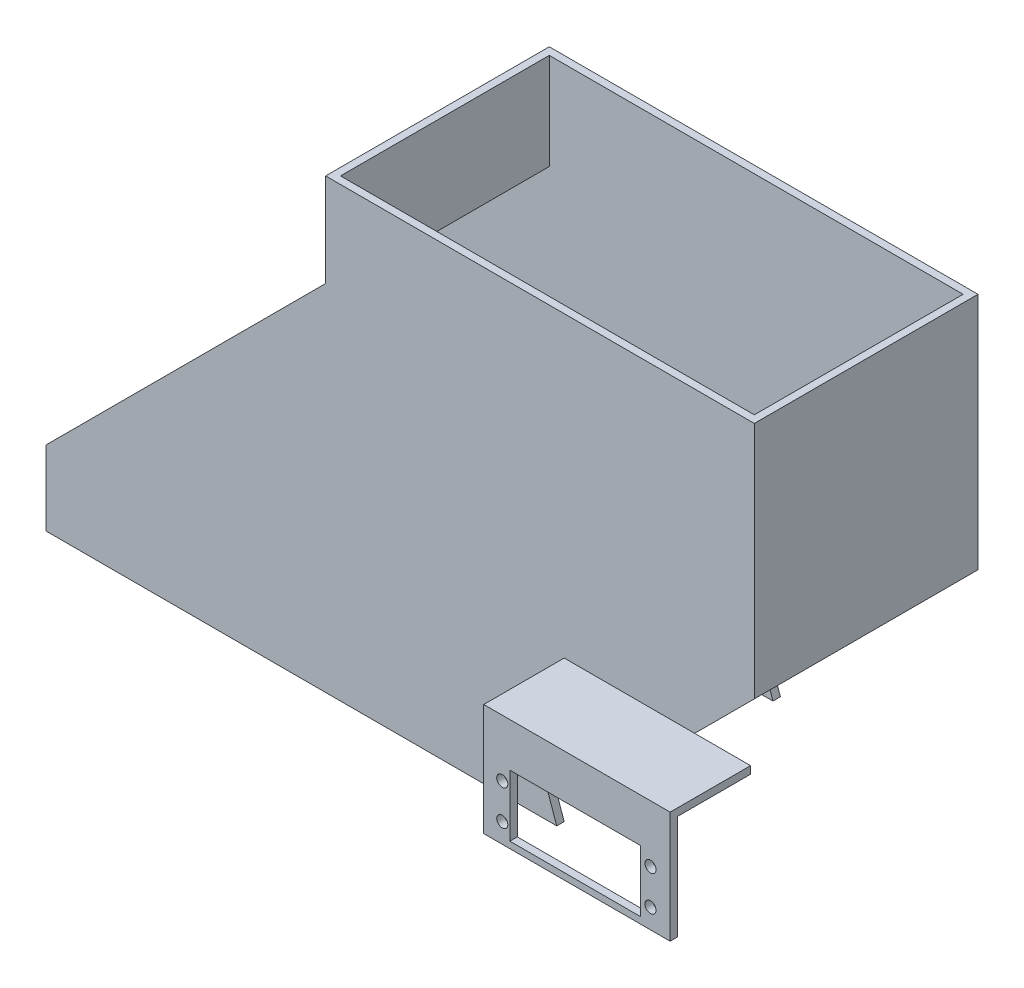
ISO-10303-21;
HEADER;
FILE_DESCRIPTION(('STEP AP214'),'2;1');
FILE_NAME('part.step','',(''),(''),'','','');
FILE_SCHEMA(('AUTOMOTIVE_DESIGN { 1 0 10303 214 1 1 1 1 }'));
ENDSEC;
DATA;
#1=APPLICATION_CONTEXT('core data for automotive mechanical design processes');
#2=APPLICATION_PROTOCOL_DEFINITION('international standard','automotive_design',2000,#1);
#3=PRODUCT_CONTEXT('',#1,'mechanical');
#4=PRODUCT('Part','Part','',(#3));
#5=PRODUCT_RELATED_PRODUCT_CATEGORY('part','',(#4));
#6=PRODUCT_DEFINITION_FORMATION('','',#4);
#7=PRODUCT_DEFINITION_CONTEXT('part definition',#1,'design');
#8=PRODUCT_DEFINITION('design','',#6,#7);
#9=PRODUCT_DEFINITION_SHAPE('','',#8);
#10=(LENGTH_UNIT() NAMED_UNIT(*) SI_UNIT(.MILLI.,.METRE.));
#11=(NAMED_UNIT(*) PLANE_ANGLE_UNIT() SI_UNIT($,.RADIAN.));
#12=(NAMED_UNIT(*) SI_UNIT($,.STERADIAN.) SOLID_ANGLE_UNIT());
#13=UNCERTAINTY_MEASURE_WITH_UNIT(LENGTH_MEASURE(1.E-05),#10,'distance_accuracy_value','');
#14=(GEOMETRIC_REPRESENTATION_CONTEXT(3) GLOBAL_UNCERTAINTY_ASSIGNED_CONTEXT((#13)) GLOBAL_UNIT_ASSIGNED_CONTEXT((#10,
#11,#12)) REPRESENTATION_CONTEXT('',''));
#15=CARTESIAN_POINT('',(0.,0.,0.));
#16=DIRECTION('',(0.,0.,1.));
#17=DIRECTION('',(1.,0.,0.));
#18=AXIS2_PLACEMENT_3D('',#15,#16,#17);
#19=CARTESIAN_POINT('',(54.0000000000001,0.,30.));
#20=DIRECTION('',(0.,1.,0.));
#21=DIRECTION('',(0.,0.,1.));
#22=AXIS2_PLACEMENT_3D('',#19,#20,#21);
#23=PLANE('',#22);
#24=DIRECTION('',(1.,0.,0.));
#25=VECTOR('',#24,1.);
#26=CARTESIAN_POINT('',(54.0000000000001,0.,-28.));
#27=LINE('',#26,#25);
#28=CARTESIAN_POINT('',(54.0000000000001,0.,-28.));
#29=VERTEX_POINT('',#28);
#30=CARTESIAN_POINT('',(74.1715728752539,0.,-28.));
#31=VERTEX_POINT('',#30);
#32=EDGE_CURVE('E317',#29,#31,#27,.T.);
#33=ORIENTED_EDGE('',*,*,#32,.F.);
#34=DIRECTION('',(0.,0.,-1.));
#35=VECTOR('',#34,1.);
#36=CARTESIAN_POINT('',(54.0000000000001,0.,30.));
#37=LINE('',#36,#35);
#38=CARTESIAN_POINT('',(54.0000000000001,0.,-30.));
#39=VERTEX_POINT('',#38);
#40=EDGE_CURVE('E409',#29,#39,#37,.T.);
#41=ORIENTED_EDGE('',*,*,#40,.T.);
#42=DIRECTION('',(1.,0.,0.));
#43=VECTOR('',#42,1.);
#44=CARTESIAN_POINT('',(54.0000000000001,0.,-30.));
#45=LINE('',#44,#43);
#46=CARTESIAN_POINT('',(77.0000000000001,0.,-30.));
#47=VERTEX_POINT('',#46);
#48=EDGE_CURVE('E352',#39,#47,#45,.T.);
#49=ORIENTED_EDGE('',*,*,#48,.T.);
#50=DIRECTION('',(0.,0.,-1.));
#51=VECTOR('',#50,1.);
#52=CARTESIAN_POINT('',(77.0000000000001,0.,30.));
#53=LINE('',#52,#51);
#54=CARTESIAN_POINT('',(77.0000000000001,0.,30.));
#55=VERTEX_POINT('',#54);
#56=EDGE_CURVE('E36',#55,#47,#53,.T.);
#57=ORIENTED_EDGE('',*,*,#56,.F.);
#58=DIRECTION('',(1.,0.,0.));
#59=VECTOR('',#58,1.);
#60=CARTESIAN_POINT('',(54.0000000000001,0.,30.));
#61=LINE('',#60,#59);
#62=CARTESIAN_POINT('',(54.0000000000001,0.,30.));
#63=VERTEX_POINT('',#62);
#64=EDGE_CURVE('E384',#63,#55,#61,.T.);
#65=ORIENTED_EDGE('',*,*,#64,.F.);
#66=CARTESIAN_POINT('',(54.0000000000001,0.,28.));
#67=VERTEX_POINT('',#66);
#68=EDGE_CURVE('E433',#63,#67,#37,.T.);
#69=ORIENTED_EDGE('',*,*,#68,.T.);
#70=DIRECTION('',(1.,0.,0.));
#71=VECTOR('',#70,1.);
#72=CARTESIAN_POINT('',(54.0000000000001,0.,28.));
#73=LINE('',#72,#71);
#74=CARTESIAN_POINT('',(74.1715728752539,0.,28.));
#75=VERTEX_POINT('',#74);
#76=EDGE_CURVE('E329',#67,#75,#73,.T.);
#77=ORIENTED_EDGE('',*,*,#76,.T.);
#78=DIRECTION('',(0.,0.,-1.));
#79=VECTOR('',#78,1.);
#80=CARTESIAN_POINT('',(74.1715728752539,0.,30.));
#81=LINE('',#80,#79);
#82=EDGE_CURVE('E324',#75,#31,#81,.T.);
#83=ORIENTED_EDGE('',*,*,#82,.T.);
#84=EDGE_LOOP('',(#33,#41,#49,#57,#65,#69,#77,#83));
#85=FACE_BOUND('',#84,.T.);
#86=ADVANCED_FACE('F33',(#85),#23,.F.);
#87=CARTESIAN_POINT('',(113.,100.,30.));
#88=DIRECTION('',(0.,-1.,0.));
#89=DIRECTION('',(1.,0.,0.));
#90=AXIS2_PLACEMENT_3D('',#87,#88,#89);
#91=PLANE('',#90);
#92=DIRECTION('',(-1.,0.,0.));
#93=VECTOR('',#92,1.);
#94=CARTESIAN_POINT('',(113.,100.,-30.));
#95=LINE('',#94,#93);
#96=CARTESIAN_POINT('',(113.,100.,-30.));
#97=VERTEX_POINT('',#96);
#98=CARTESIAN_POINT('',(-2.00000000000025,100.,-30.));
#99=VERTEX_POINT('',#98);
#100=EDGE_CURVE('E416',#97,#99,#95,.T.);
#101=ORIENTED_EDGE('',*,*,#100,.T.);
#102=DIRECTION('',(0.,0.,-1.));
#103=VECTOR('',#102,1.);
#104=CARTESIAN_POINT('',(-2.00000000000025,100.,30.));
#105=LINE('',#104,#103);
#106=CARTESIAN_POINT('',(-2.00000000000025,100.,30.));
#107=VERTEX_POINT('',#106);
#108=EDGE_CURVE('E454',#107,#99,#105,.T.);
#109=ORIENTED_EDGE('',*,*,#108,.F.);
#110=DIRECTION('',(-1.,0.,0.));
#111=VECTOR('',#110,1.);
#112=CARTESIAN_POINT('',(113.,100.,30.));
#113=LINE('',#112,#111);
#114=CARTESIAN_POINT('',(113.,100.,30.));
#115=VERTEX_POINT('',#114);
#116=EDGE_CURVE('E395',#115,#107,#113,.T.);
#117=ORIENTED_EDGE('',*,*,#116,.F.);
#118=DIRECTION('',(0.,0.,-1.));
#119=VECTOR('',#118,1.);
#120=CARTESIAN_POINT('',(113.,100.,30.));
#121=LINE('',#120,#119);
#122=EDGE_CURVE('E457',#115,#97,#121,.T.);
#123=ORIENTED_EDGE('',*,*,#122,.T.);
#124=EDGE_LOOP('',(#101,#109,#117,#123));
#125=FACE_BOUND('',#124,.T.);
#126=DIRECTION('',(-1.,0.,0.));
#127=VECTOR('',#126,1.);
#128=CARTESIAN_POINT('',(113.,100.,-28.));
#129=LINE('',#128,#127);
#130=CARTESIAN_POINT('',(111.,100.,-28.));
#131=VERTEX_POINT('',#130);
#132=CARTESIAN_POINT('',(-2.51534904016637E-13,100.,-28.));
#133=VERTEX_POINT('',#132);
#134=EDGE_CURVE('E331',#131,#133,#129,.T.);
#135=ORIENTED_EDGE('',*,*,#134,.F.);
#136=DIRECTION('',(0.,0.,-1.));
#137=VECTOR('',#136,1.);
#138=CARTESIAN_POINT('',(111.,100.,30.));
#139=LINE('',#138,#137);
#140=CARTESIAN_POINT('',(111.,100.,28.));
#141=VERTEX_POINT('',#140);
#142=EDGE_CURVE('E325',#141,#131,#139,.T.);
#143=ORIENTED_EDGE('',*,*,#142,.F.);
#144=DIRECTION('',(-1.,0.,0.));
#145=VECTOR('',#144,1.);
#146=CARTESIAN_POINT('',(113.,100.,28.));
#147=LINE('',#146,#145);
#148=CARTESIAN_POINT('',(-2.51534904016637E-13,100.,28.));
#149=VERTEX_POINT('',#148);
#150=EDGE_CURVE('E334',#141,#149,#147,.T.);
#151=ORIENTED_EDGE('',*,*,#150,.T.);
#152=DIRECTION('',(0.,0.,-1.));
#153=VECTOR('',#152,1.);
#154=CARTESIAN_POINT('',(-2.51534904016637E-13,100.,30.));
#155=LINE('',#154,#153);
#156=EDGE_CURVE('E346',#149,#133,#155,.T.);
#157=ORIENTED_EDGE('',*,*,#156,.T.);
#158=EDGE_LOOP('',(#135,#143,#151,#157));
#159=FACE_BOUND('',#158,.T.);
#160=ADVANCED_FACE('F490',(#125,#159),#91,.F.);
#161=CARTESIAN_POINT('',(-76.9999999999999,0.,30.));
#162=DIRECTION('',(1.,0.,0.));
#163=DIRECTION('',(0.,1.,0.));
#164=AXIS2_PLACEMENT_3D('',#161,#162,#163);
#165=PLANE('',#164);
#166=DIRECTION('',(0.,-1.,0.));
#167=VECTOR('',#166,1.);
#168=CARTESIAN_POINT('',(-76.9999999999999,0.,-28.));
#169=LINE('',#168,#167);
#170=CARTESIAN_POINT('',(-76.9999999999999,-2.82842712474619,-28.));
#171=VERTEX_POINT('',#170);
#172=CARTESIAN_POINT('',(-76.9999999999999,-20.,-28.));
#173=VERTEX_POINT('',#172);
#174=EDGE_CURVE('E349',#171,#173,#169,.T.);
#175=ORIENTED_EDGE('',*,*,#174,.F.);
#176=DIRECTION('',(0.,0.,-1.));
#177=VECTOR('',#176,1.);
#178=CARTESIAN_POINT('',(-76.9999999999999,-2.82842712474619,30.));
#179=LINE('',#178,#177);
#180=CARTESIAN_POINT('',(-76.9999999999999,-2.82842712474619,28.));
#181=VERTEX_POINT('',#180);
#182=EDGE_CURVE('E347',#181,#171,#179,.T.);
#183=ORIENTED_EDGE('',*,*,#182,.F.);
#184=DIRECTION('',(0.,-1.,0.));
#185=VECTOR('',#184,1.);
#186=CARTESIAN_POINT('',(-76.9999999999999,0.,28.));
#187=LINE('',#186,#185);
#188=CARTESIAN_POINT('',(-76.9999999999999,-20.,28.));
#189=VERTEX_POINT('',#188);
#190=EDGE_CURVE('E339',#181,#189,#187,.T.);
#191=ORIENTED_EDGE('',*,*,#190,.T.);
#192=DIRECTION('',(0.,0.,-1.));
#193=VECTOR('',#192,1.);
#194=CARTESIAN_POINT('',(-76.9999999999999,-20.,30.));
#195=LINE('',#194,#193);
#196=CARTESIAN_POINT('',(-76.9999999999999,-20.,30.));
#197=VERTEX_POINT('',#196);
#198=EDGE_CURVE('E445',#197,#189,#195,.T.);
#199=ORIENTED_EDGE('',*,*,#198,.F.);
#200=DIRECTION('',(0.,-1.,0.));
#201=VECTOR('',#200,1.);
#202=CARTESIAN_POINT('',(-76.9999999999999,0.,30.));
#203=LINE('',#202,#201);
#204=CARTESIAN_POINT('',(-76.9999999999999,0.,30.));
#205=VERTEX_POINT('',#204);
#206=EDGE_CURVE('E401',#205,#197,#203,.T.);
#207=ORIENTED_EDGE('',*,*,#206,.F.);
#208=DIRECTION('',(0.,0.,-1.));
#209=VECTOR('',#208,1.);
#210=CARTESIAN_POINT('',(-76.9999999999999,0.,30.));
#211=LINE('',#210,#209);
#212=CARTESIAN_POINT('',(-76.9999999999999,0.,-30.));
#213=VERTEX_POINT('',#212);
#214=EDGE_CURVE('E448',#205,#213,#211,.T.);
#215=ORIENTED_EDGE('',*,*,#214,.T.);
#216=DIRECTION('',(0.,-1.,0.));
#217=VECTOR('',#216,1.);
#218=CARTESIAN_POINT('',(-76.9999999999999,0.,-30.));
#219=LINE('',#218,#217);
#220=CARTESIAN_POINT('',(-76.9999999999999,-20.,-30.));
#221=VERTEX_POINT('',#220);
#222=EDGE_CURVE('E422',#213,#221,#219,.T.);
#223=ORIENTED_EDGE('',*,*,#222,.T.);
#224=EDGE_CURVE('E444',#173,#221,#195,.T.);
#225=ORIENTED_EDGE('',*,*,#224,.F.);
#226=EDGE_LOOP('',(#175,#183,#191,#199,#207,#215,#223,#225));
#227=FACE_BOUND('',#226,.T.);
#228=ADVANCED_FACE('F507',(#227),#165,.F.);
#229=CARTESIAN_POINT('',(-76.9999999999999,-20.,30.));
#230=DIRECTION('',(0.,1.,0.));
#231=DIRECTION('',(0.,0.,1.));
#232=AXIS2_PLACEMENT_3D('',#229,#230,#231);
#233=PLANE('',#232);
#234=DIRECTION('',(1.,0.,0.));
#235=VECTOR('',#234,1.);
#236=CARTESIAN_POINT('',(-76.9999999999999,-20.,-28.));
#237=LINE('',#236,#235);
#238=CARTESIAN_POINT('',(60.0000000000001,-20.,-28.));
#239=VERTEX_POINT('',#238);
#240=EDGE_CURVE('E370',#173,#239,#237,.T.);
#241=ORIENTED_EDGE('',*,*,#240,.F.);
#242=ORIENTED_EDGE('',*,*,#224,.T.);
#243=DIRECTION('',(1.,0.,0.));
#244=VECTOR('',#243,1.);
#245=CARTESIAN_POINT('',(-76.9999999999999,-20.,-30.));
#246=LINE('',#245,#244);
#247=CARTESIAN_POINT('',(60.0000000000001,-20.,-30.));
#248=VERTEX_POINT('',#247);
#249=EDGE_CURVE('E425',#221,#248,#246,.T.);
#250=ORIENTED_EDGE('',*,*,#249,.T.);
#251=DIRECTION('',(0.,0.,-1.));
#252=VECTOR('',#251,1.);
#253=CARTESIAN_POINT('',(60.0000000000001,-20.,30.));
#254=LINE('',#253,#252);
#255=EDGE_CURVE('E440',#239,#248,#254,.T.);
#256=ORIENTED_EDGE('',*,*,#255,.F.);
#257=EDGE_LOOP('',(#241,#242,#250,#256));
#258=FACE_BOUND('',#257,.T.);
#259=ADVANCED_FACE('F534',(#258),#233,.F.);
#260=CARTESIAN_POINT('',(54.0000000000001,-3.,30.));
#261=DIRECTION('',(-0.942990333582889,-0.332820117735138,0.));
#262=DIRECTION('',(0.332820117735138,-0.942990333582889,0.));
#263=AXIS2_PLACEMENT_3D('',#260,#261,#262);
#264=PLANE('',#263);
#265=DIRECTION('',(-0.332820117735138,0.942990333582889,0.));
#266=VECTOR('',#265,1.);
#267=CARTESIAN_POINT('',(54.0000000000001,-3.,-28.));
#268=LINE('',#267,#266);
#269=CARTESIAN_POINT('',(54.0000000000001,-3.,-28.));
#270=VERTEX_POINT('',#269);
#271=EDGE_CURVE('E372',#239,#270,#268,.T.);
#272=ORIENTED_EDGE('',*,*,#271,.F.);
#273=ORIENTED_EDGE('',*,*,#255,.T.);
#274=DIRECTION('',(-0.332820117735138,0.942990333582889,0.));
#275=VECTOR('',#274,1.);
#276=CARTESIAN_POINT('',(54.0000000000001,-3.,-30.));
#277=LINE('',#276,#275);
#278=CARTESIAN_POINT('',(54.0000000000001,-3.,-30.));
#279=VERTEX_POINT('',#278);
#280=EDGE_CURVE('E428',#248,#279,#277,.T.);
#281=ORIENTED_EDGE('',*,*,#280,.T.);
#282=DIRECTION('',(0.,0.,-1.));
#283=VECTOR('',#282,1.);
#284=CARTESIAN_POINT('',(54.0000000000001,-3.,30.));
#285=LINE('',#284,#283);
#286=EDGE_CURVE('E436',#270,#279,#285,.T.);
#287=ORIENTED_EDGE('',*,*,#286,.F.);
#288=EDGE_LOOP('',(#272,#273,#281,#287));
#289=FACE_BOUND('',#288,.T.);
#290=ADVANCED_FACE('F542',(#289),#264,.F.);
#291=CARTESIAN_POINT('',(54.0000000000001,-3.,30.));
#292=DIRECTION('',(-1.,0.,0.));
#293=DIRECTION('',(0.,-1.,0.));
#294=AXIS2_PLACEMENT_3D('',#291,#292,#293);
#295=PLANE('',#294);
#296=DIRECTION('',(0.,1.,0.));
#297=VECTOR('',#296,1.);
#298=CARTESIAN_POINT('',(54.0000000000001,-3.,-28.));
#299=LINE('',#298,#297);
#300=EDGE_CURVE('E355',#270,#29,#299,.T.);
#301=ORIENTED_EDGE('',*,*,#300,.F.);
#302=ORIENTED_EDGE('',*,*,#286,.T.);
#303=DIRECTION('',(0.,1.,0.));
#304=VECTOR('',#303,1.);
#305=CARTESIAN_POINT('',(54.0000000000001,-3.,-30.));
#306=LINE('',#305,#304);
#307=EDGE_CURVE('E388',#279,#39,#306,.T.);
#308=ORIENTED_EDGE('',*,*,#307,.T.);
#309=ORIENTED_EDGE('',*,*,#40,.F.);
#310=EDGE_LOOP('',(#301,#302,#308,#309));
#311=FACE_BOUND('',#310,.T.);
#312=ADVANCED_FACE('F544',(#311),#295,.F.);
#313=CARTESIAN_POINT('',(77.0000000000001,0.,30.));
#314=DIRECTION('',(-0.707106781186549,0.707106781186546,0.));
#315=DIRECTION('',(-0.707106781186546,-0.707106781186549,0.));
#316=AXIS2_PLACEMENT_3D('',#313,#314,#315);
#317=PLANE('',#316);
#318=DIRECTION('',(0.707106781186546,0.707106781186548,0.));
#319=VECTOR('',#318,1.);
#320=CARTESIAN_POINT('',(77.0000000000001,0.,-30.));
#321=LINE('',#320,#319);
#322=CARTESIAN_POINT('',(113.,35.9999999999998,-30.));
#323=VERTEX_POINT('',#322);
#324=EDGE_CURVE('E412',#47,#323,#321,.T.);
#325=ORIENTED_EDGE('',*,*,#324,.T.);
#326=DIRECTION('',(0.,0.,-1.));
#327=VECTOR('',#326,1.);
#328=CARTESIAN_POINT('',(113.,35.9999999999998,30.));
#329=LINE('',#328,#327);
#330=CARTESIAN_POINT('',(113.,35.9999999999998,30.));
#331=VERTEX_POINT('',#330);
#332=EDGE_CURVE('E459',#331,#323,#329,.T.);
#333=ORIENTED_EDGE('',*,*,#332,.F.);
#334=DIRECTION('',(0.707106781186546,0.707106781186548,0.));
#335=VECTOR('',#334,1.);
#336=CARTESIAN_POINT('',(77.0000000000001,0.,30.));
#337=LINE('',#336,#335);
#338=CARTESIAN_POINT('',(97.,20.,30.));
#339=VERTEX_POINT('',#338);
#340=EDGE_CURVE('E387',#339,#331,#337,.T.);
#341=ORIENTED_EDGE('',*,*,#340,.F.);
#342=CARTESIAN_POINT('',(95.,18.,30.));
#343=VERTEX_POINT('',#342);
#344=EDGE_CURVE('E393',#343,#339,#337,.T.);
#345=ORIENTED_EDGE('',*,*,#344,.F.);
#346=EDGE_CURVE('E389',#55,#343,#337,.T.);
#347=ORIENTED_EDGE('',*,*,#346,.F.);
#348=ORIENTED_EDGE('',*,*,#56,.T.);
#349=EDGE_LOOP('',(#325,#333,#341,#345,#347,#348));
#350=FACE_BOUND('',#349,.T.);
#351=ADVANCED_FACE('F483',(#350),#317,.F.);
#352=CARTESIAN_POINT('',(113.,35.9999999999998,30.));
#353=DIRECTION('',(-1.,0.,0.));
#354=DIRECTION('',(0.,-1.,0.));
#355=AXIS2_PLACEMENT_3D('',#352,#353,#354);
#356=PLANE('',#355);
#357=DIRECTION('',(0.,1.,0.));
#358=VECTOR('',#357,1.);
#359=CARTESIAN_POINT('',(113.,35.9999999999998,-30.));
#360=LINE('',#359,#358);
#361=EDGE_CURVE('E414',#323,#97,#360,.T.);
#362=ORIENTED_EDGE('',*,*,#361,.T.);
#363=ORIENTED_EDGE('',*,*,#122,.F.);
#364=DIRECTION('',(0.,1.,0.));
#365=VECTOR('',#364,1.);
#366=CARTESIAN_POINT('',(113.,35.9999999999998,30.));
#367=LINE('',#366,#365);
#368=EDGE_CURVE('E392',#331,#115,#367,.T.);
#369=ORIENTED_EDGE('',*,*,#368,.F.);
#370=ORIENTED_EDGE('',*,*,#332,.T.);
#371=EDGE_LOOP('',(#362,#363,#369,#370));
#372=FACE_BOUND('',#371,.T.);
#373=ADVANCED_FACE('F485',(#372),#356,.F.);
#374=CARTESIAN_POINT('',(-2.00000000000025,100.,30.));
#375=DIRECTION('',(1.,0.,0.));
#376=DIRECTION('',(0.,1.,0.));
#377=AXIS2_PLACEMENT_3D('',#374,#375,#376);
#378=PLANE('',#377);
#379=DIRECTION('',(0.,-1.,0.));
#380=VECTOR('',#379,1.);
#381=CARTESIAN_POINT('',(-2.00000000000025,100.,-30.));
#382=LINE('',#381,#380);
#383=CARTESIAN_POINT('',(-2.00000000000022,74.9999999999999,-30.));
#384=VERTEX_POINT('',#383);
#385=EDGE_CURVE('E418',#99,#384,#382,.T.);
#386=ORIENTED_EDGE('',*,*,#385,.T.);
#387=DIRECTION('',(0.,0.,-1.));
#388=VECTOR('',#387,1.);
#389=CARTESIAN_POINT('',(-2.00000000000022,74.9999999999999,30.));
#390=LINE('',#389,#388);
#391=CARTESIAN_POINT('',(-2.00000000000022,74.9999999999999,30.));
#392=VERTEX_POINT('',#391);
#393=EDGE_CURVE('E451',#392,#384,#390,.T.);
#394=ORIENTED_EDGE('',*,*,#393,.F.);
#395=DIRECTION('',(0.,-1.,0.));
#396=VECTOR('',#395,1.);
#397=CARTESIAN_POINT('',(-2.00000000000025,100.,30.));
#398=LINE('',#397,#396);
#399=EDGE_CURVE('E397',#107,#392,#398,.T.);
#400=ORIENTED_EDGE('',*,*,#399,.F.);
#401=ORIENTED_EDGE('',*,*,#108,.T.);
#402=EDGE_LOOP('',(#386,#394,#400,#401));
#403=FACE_BOUND('',#402,.T.);
#404=ADVANCED_FACE('F497',(#403),#378,.F.);
#405=CARTESIAN_POINT('',(-2.00000000000022,74.9999999999999,30.));
#406=DIRECTION('',(0.707106781186549,-0.707106781186546,0.));
#407=DIRECTION('',(0.707106781186546,0.707106781186549,0.));
#408=AXIS2_PLACEMENT_3D('',#405,#406,#407);
#409=PLANE('',#408);
#410=DIRECTION('',(-0.707106781186546,-0.707106781186549,0.));
#411=VECTOR('',#410,1.);
#412=CARTESIAN_POINT('',(-2.00000000000022,74.9999999999999,-30.));
#413=LINE('',#412,#411);
#414=EDGE_CURVE('E420',#384,#213,#413,.T.);
#415=ORIENTED_EDGE('',*,*,#414,.T.);
#416=ORIENTED_EDGE('',*,*,#214,.F.);
#417=DIRECTION('',(-0.707106781186546,-0.707106781186549,0.));
#418=VECTOR('',#417,1.);
#419=CARTESIAN_POINT('',(-2.00000000000022,74.9999999999999,30.));
#420=LINE('',#419,#418);
#421=EDGE_CURVE('E399',#392,#205,#420,.T.);
#422=ORIENTED_EDGE('',*,*,#421,.F.);
#423=ORIENTED_EDGE('',*,*,#393,.T.);
#424=EDGE_LOOP('',(#415,#416,#422,#423));
#425=FACE_BOUND('',#424,.T.);
#426=ADVANCED_FACE('F501',(#425),#409,.F.);
#427=ORIENTED_EDGE('',*,*,#198,.T.);
#428=DIRECTION('',(1.,0.,0.));
#429=VECTOR('',#428,1.);
#430=CARTESIAN_POINT('',(-76.9999999999999,-20.,28.));
#431=LINE('',#430,#429);
#432=CARTESIAN_POINT('',(60.0000000000001,-20.,28.));
#433=VERTEX_POINT('',#432);
#434=EDGE_CURVE('E362',#189,#433,#431,.T.);
#435=ORIENTED_EDGE('',*,*,#434,.T.);
#436=CARTESIAN_POINT('',(60.0000000000001,-20.,30.));
#437=VERTEX_POINT('',#436);
#438=EDGE_CURVE('E441',#437,#433,#254,.T.);
#439=ORIENTED_EDGE('',*,*,#438,.F.);
#440=DIRECTION('',(1.,0.,0.));
#441=VECTOR('',#440,1.);
#442=CARTESIAN_POINT('',(-76.9999999999999,-20.,30.));
#443=LINE('',#442,#441);
#444=EDGE_CURVE('E403',#197,#437,#443,.T.);
#445=ORIENTED_EDGE('',*,*,#444,.F.);
#446=EDGE_LOOP('',(#427,#435,#439,#445));
#447=FACE_BOUND('',#446,.T.);
#448=ADVANCED_FACE('F513',(#447),#233,.F.);
#449=ORIENTED_EDGE('',*,*,#438,.T.);
#450=DIRECTION('',(-0.332820117735138,0.942990333582889,0.));
#451=VECTOR('',#450,1.);
#452=CARTESIAN_POINT('',(54.0000000000001,-3.,28.));
#453=LINE('',#452,#451);
#454=CARTESIAN_POINT('',(54.0000000000001,-3.,28.));
#455=VERTEX_POINT('',#454);
#456=EDGE_CURVE('E359',#433,#455,#453,.T.);
#457=ORIENTED_EDGE('',*,*,#456,.T.);
#458=CARTESIAN_POINT('',(54.0000000000001,-3.,30.));
#459=VERTEX_POINT('',#458);
#460=EDGE_CURVE('E437',#459,#455,#285,.T.);
#461=ORIENTED_EDGE('',*,*,#460,.F.);
#462=DIRECTION('',(-0.332820117735138,0.942990333582889,0.));
#463=VECTOR('',#462,1.);
#464=CARTESIAN_POINT('',(54.0000000000001,-3.,30.));
#465=LINE('',#464,#463);
#466=EDGE_CURVE('E405',#437,#459,#465,.T.);
#467=ORIENTED_EDGE('',*,*,#466,.F.);
#468=EDGE_LOOP('',(#449,#457,#461,#467));
#469=FACE_BOUND('',#468,.T.);
#470=ADVANCED_FACE('F515',(#469),#264,.F.);
#471=ORIENTED_EDGE('',*,*,#460,.T.);
#472=DIRECTION('',(0.,1.,0.));
#473=VECTOR('',#472,1.);
#474=CARTESIAN_POINT('',(54.0000000000001,-3.,28.));
#475=LINE('',#474,#473);
#476=EDGE_CURVE('E356',#455,#67,#475,.T.);
#477=ORIENTED_EDGE('',*,*,#476,.T.);
#478=ORIENTED_EDGE('',*,*,#68,.F.);
#479=DIRECTION('',(0.,1.,0.));
#480=VECTOR('',#479,1.);
#481=CARTESIAN_POINT('',(54.0000000000001,-3.,30.));
#482=LINE('',#481,#480);
#483=EDGE_CURVE('E407',#459,#63,#482,.T.);
#484=ORIENTED_EDGE('',*,*,#483,.F.);
#485=EDGE_LOOP('',(#471,#477,#478,#484));
#486=FACE_BOUND('',#485,.T.);
#487=ADVANCED_FACE('F519',(#486),#295,.F.);
#488=CARTESIAN_POINT('',(0.,0.,30.));
#489=DIRECTION('',(0.,0.,1.));
#490=DIRECTION('',(1.,0.,0.));
#491=AXIS2_PLACEMENT_3D('',#488,#489,#490);
#492=PLANE('',#491);
#493=DIRECTION('',(-1.,0.,0.));
#494=VECTOR('',#493,1.);
#495=CARTESIAN_POINT('',(112.,20.,30.));
#496=LINE('',#495,#494);
#497=CARTESIAN_POINT('',(61.9999999999997,20.,30.));
#498=VERTEX_POINT('',#497);
#499=EDGE_CURVE('E11',#339,#498,#496,.T.);
#500=ORIENTED_EDGE('',*,*,#499,.F.);
#501=ORIENTED_EDGE('',*,*,#340,.T.);
#502=ORIENTED_EDGE('',*,*,#368,.T.);
#503=ORIENTED_EDGE('',*,*,#116,.T.);
#504=ORIENTED_EDGE('',*,*,#399,.T.);
#505=ORIENTED_EDGE('',*,*,#421,.T.);
#506=ORIENTED_EDGE('',*,*,#206,.T.);
#507=ORIENTED_EDGE('',*,*,#444,.T.);
#508=ORIENTED_EDGE('',*,*,#466,.T.);
#509=ORIENTED_EDGE('',*,*,#483,.T.);
#510=ORIENTED_EDGE('',*,*,#64,.T.);
#511=ORIENTED_EDGE('',*,*,#346,.T.);
#512=DIRECTION('',(-1.,0.,0.));
#513=VECTOR('',#512,1.);
#514=CARTESIAN_POINT('',(112.,18.,30.));
#515=LINE('',#514,#513);
#516=CARTESIAN_POINT('',(61.9999999999997,18.,30.));
#517=VERTEX_POINT('',#516);
#518=EDGE_CURVE('E41',#343,#517,#515,.T.);
#519=ORIENTED_EDGE('',*,*,#518,.T.);
#520=DIRECTION('',(0.,1.,0.));
#521=VECTOR('',#520,1.);
#522=CARTESIAN_POINT('',(61.9999999999997,20.,30.));
#523=LINE('',#522,#521);
#524=EDGE_CURVE('E278',#517,#498,#523,.T.);
#525=ORIENTED_EDGE('',*,*,#524,.T.);
#526=EDGE_LOOP('',(#500,#501,#502,#503,#504,#505,#506,#507,#508,#509,#510,#511,#519,#525));
#527=FACE_BOUND('',#526,.T.);
#528=ADVANCED_FACE('F471',(#527),#492,.T.);
#529=CARTESIAN_POINT('',(0.,0.,-30.));
#530=DIRECTION('',(0.,0.,1.));
#531=DIRECTION('',(1.,0.,0.));
#532=AXIS2_PLACEMENT_3D('',#529,#530,#531);
#533=PLANE('',#532);
#534=ORIENTED_EDGE('',*,*,#48,.F.);
#535=ORIENTED_EDGE('',*,*,#307,.F.);
#536=ORIENTED_EDGE('',*,*,#280,.F.);
#537=ORIENTED_EDGE('',*,*,#249,.F.);
#538=ORIENTED_EDGE('',*,*,#222,.F.);
#539=ORIENTED_EDGE('',*,*,#414,.F.);
#540=ORIENTED_EDGE('',*,*,#385,.F.);
#541=ORIENTED_EDGE('',*,*,#100,.F.);
#542=ORIENTED_EDGE('',*,*,#361,.F.);
#543=ORIENTED_EDGE('',*,*,#324,.F.);
#544=EDGE_LOOP('',(#534,#535,#536,#537,#538,#539,#540,#541,#542,#543));
#545=FACE_BOUND('',#544,.T.);
#546=ADVANCED_FACE('F527',(#545),#533,.F.);
#547=CARTESIAN_POINT('',(75.585786437627,1.41421356237309,30.));
#548=DIRECTION('',(-0.707106781186549,0.707106781186546,0.));
#549=DIRECTION('',(-0.707106781186546,-0.707106781186549,0.));
#550=AXIS2_PLACEMENT_3D('',#547,#548,#549);
#551=PLANE('',#550);
#552=DIRECTION('',(0.707106781186546,0.707106781186549,0.));
#553=VECTOR('',#552,1.);
#554=CARTESIAN_POINT('',(75.585786437627,1.41421356237309,-28.));
#555=LINE('',#554,#553);
#556=CARTESIAN_POINT('',(111.,36.828427124746,-28.));
#557=VERTEX_POINT('',#556);
#558=EDGE_CURVE('E318',#31,#557,#555,.T.);
#559=ORIENTED_EDGE('',*,*,#558,.F.);
#560=ORIENTED_EDGE('',*,*,#82,.F.);
#561=DIRECTION('',(0.707106781186546,0.707106781186549,0.));
#562=VECTOR('',#561,1.);
#563=CARTESIAN_POINT('',(75.585786437627,1.41421356237309,28.));
#564=LINE('',#563,#562);
#565=CARTESIAN_POINT('',(111.,36.828427124746,28.));
#566=VERTEX_POINT('',#565);
#567=EDGE_CURVE('E326',#75,#566,#564,.T.);
#568=ORIENTED_EDGE('',*,*,#567,.T.);
#569=DIRECTION('',(0.,0.,-1.));
#570=VECTOR('',#569,1.);
#571=CARTESIAN_POINT('',(111.,36.828427124746,30.));
#572=LINE('',#571,#570);
#573=EDGE_CURVE('E321',#566,#557,#572,.T.);
#574=ORIENTED_EDGE('',*,*,#573,.T.);
#575=EDGE_LOOP('',(#559,#560,#568,#574));
#576=FACE_BOUND('',#575,.T.);
#577=ADVANCED_FACE('F547',(#576),#551,.T.);
#578=CARTESIAN_POINT('',(111.,35.9999999999998,30.));
#579=DIRECTION('',(-1.,0.,0.));
#580=DIRECTION('',(0.,-1.,0.));
#581=AXIS2_PLACEMENT_3D('',#578,#579,#580);
#582=PLANE('',#581);
#583=DIRECTION('',(0.,1.,0.));
#584=VECTOR('',#583,1.);
#585=CARTESIAN_POINT('',(111.,35.9999999999998,-28.));
#586=LINE('',#585,#584);
#587=EDGE_CURVE('E320',#557,#131,#586,.T.);
#588=ORIENTED_EDGE('',*,*,#587,.F.);
#589=ORIENTED_EDGE('',*,*,#573,.F.);
#590=DIRECTION('',(0.,1.,0.));
#591=VECTOR('',#590,1.);
#592=CARTESIAN_POINT('',(111.,35.9999999999998,28.));
#593=LINE('',#592,#591);
#594=EDGE_CURVE('E328',#566,#141,#593,.T.);
#595=ORIENTED_EDGE('',*,*,#594,.T.);
#596=ORIENTED_EDGE('',*,*,#142,.T.);
#597=EDGE_LOOP('',(#588,#589,#595,#596));
#598=FACE_BOUND('',#597,.T.);
#599=ADVANCED_FACE('F554',(#598),#582,.T.);
#600=CARTESIAN_POINT('',(-2.51534904016637E-13,100.,30.));
#601=DIRECTION('',(1.,0.,0.));
#602=DIRECTION('',(0.,1.,0.));
#603=AXIS2_PLACEMENT_3D('',#600,#601,#602);
#604=PLANE('',#603);
#605=DIRECTION('',(0.,-1.,0.));
#606=VECTOR('',#605,1.);
#607=CARTESIAN_POINT('',(-2.51534904016637E-13,100.,-28.));
#608=LINE('',#607,#606);
#609=CARTESIAN_POINT('',(-2.22859589532891E-13,74.1715728752537,-28.));
#610=VERTEX_POINT('',#609);
#611=EDGE_CURVE('E340',#133,#610,#608,.T.);
#612=ORIENTED_EDGE('',*,*,#611,.F.);
#613=ORIENTED_EDGE('',*,*,#156,.F.);
#614=DIRECTION('',(0.,-1.,0.));
#615=VECTOR('',#614,1.);
#616=CARTESIAN_POINT('',(-2.51534904016637E-13,100.,28.));
#617=LINE('',#616,#615);
#618=CARTESIAN_POINT('',(-2.22859589532891E-13,74.1715728752537,28.));
#619=VERTEX_POINT('',#618);
#620=EDGE_CURVE('E335',#149,#619,#617,.T.);
#621=ORIENTED_EDGE('',*,*,#620,.T.);
#622=DIRECTION('',(0.,0.,-1.));
#623=VECTOR('',#622,1.);
#624=CARTESIAN_POINT('',(-2.22859589532891E-13,74.1715728752537,30.));
#625=LINE('',#624,#623);
#626=EDGE_CURVE('E343',#619,#610,#625,.T.);
#627=ORIENTED_EDGE('',*,*,#626,.T.);
#628=EDGE_LOOP('',(#612,#613,#621,#627));
#629=FACE_BOUND('',#628,.T.);
#630=ADVANCED_FACE('F558',(#629),#604,.T.);
#631=CARTESIAN_POINT('',(-0.585786437627126,73.5857864376268,30.));
#632=DIRECTION('',(0.707106781186549,-0.707106781186546,0.));
#633=DIRECTION('',(0.707106781186546,0.707106781186549,0.));
#634=AXIS2_PLACEMENT_3D('',#631,#632,#633);
#635=PLANE('',#634);
#636=DIRECTION('',(-0.707106781186546,-0.707106781186549,0.));
#637=VECTOR('',#636,1.);
#638=CARTESIAN_POINT('',(-0.585786437627126,73.5857864376268,-28.));
#639=LINE('',#638,#637);
#640=EDGE_CURVE('E342',#610,#171,#639,.T.);
#641=ORIENTED_EDGE('',*,*,#640,.F.);
#642=ORIENTED_EDGE('',*,*,#626,.F.);
#643=DIRECTION('',(-0.707106781186546,-0.707106781186549,0.));
#644=VECTOR('',#643,1.);
#645=CARTESIAN_POINT('',(-0.585786437627126,73.5857864376268,28.));
#646=LINE('',#645,#644);
#647=EDGE_CURVE('E337',#619,#181,#646,.T.);
#648=ORIENTED_EDGE('',*,*,#647,.T.);
#649=ORIENTED_EDGE('',*,*,#182,.T.);
#650=EDGE_LOOP('',(#641,#642,#648,#649));
#651=FACE_BOUND('',#650,.T.);
#652=ADVANCED_FACE('F566',(#651),#635,.T.);
#653=CARTESIAN_POINT('',(0.,0.,28.));
#654=DIRECTION('',(0.,0.,1.));
#655=DIRECTION('',(1.,0.,0.));
#656=AXIS2_PLACEMENT_3D('',#653,#654,#655);
#657=PLANE('',#656);
#658=ORIENTED_EDGE('',*,*,#76,.F.);
#659=ORIENTED_EDGE('',*,*,#476,.F.);
#660=ORIENTED_EDGE('',*,*,#456,.F.);
#661=ORIENTED_EDGE('',*,*,#434,.F.);
#662=ORIENTED_EDGE('',*,*,#190,.F.);
#663=ORIENTED_EDGE('',*,*,#647,.F.);
#664=ORIENTED_EDGE('',*,*,#620,.F.);
#665=ORIENTED_EDGE('',*,*,#150,.F.);
#666=ORIENTED_EDGE('',*,*,#594,.F.);
#667=ORIENTED_EDGE('',*,*,#567,.F.);
#668=EDGE_LOOP('',(#658,#659,#660,#661,#662,#663,#664,#665,#666,#667));
#669=FACE_BOUND('',#668,.T.);
#670=ADVANCED_FACE('F562',(#669),#657,.F.);
#671=CARTESIAN_POINT('',(0.,0.,-28.));
#672=DIRECTION('',(0.,0.,1.));
#673=DIRECTION('',(1.,0.,0.));
#674=AXIS2_PLACEMENT_3D('',#671,#672,#673);
#675=PLANE('',#674);
#676=ORIENTED_EDGE('',*,*,#32,.T.);
#677=ORIENTED_EDGE('',*,*,#558,.T.);
#678=ORIENTED_EDGE('',*,*,#587,.T.);
#679=ORIENTED_EDGE('',*,*,#134,.T.);
#680=ORIENTED_EDGE('',*,*,#611,.T.);
#681=ORIENTED_EDGE('',*,*,#640,.T.);
#682=ORIENTED_EDGE('',*,*,#174,.T.);
#683=ORIENTED_EDGE('',*,*,#240,.T.);
#684=ORIENTED_EDGE('',*,*,#271,.T.);
#685=ORIENTED_EDGE('',*,*,#300,.T.);
#686=EDGE_LOOP('',(#676,#677,#678,#679,#680,#681,#682,#683,#684,#685));
#687=FACE_BOUND('',#686,.T.);
#688=ADVANCED_FACE('F538',(#687),#675,.T.);
#689=CARTESIAN_POINT('',(112.,20.,30.));
#690=DIRECTION('',(0.,0.,1.));
#691=DIRECTION('',(1.,0.,0.));
#692=AXIS2_PLACEMENT_3D('',#689,#690,#691);
#693=PLANE('',#692);
#694=CARTESIAN_POINT('',(112.,18.,30.));
#695=VERTEX_POINT('',#694);
#696=EDGE_CURVE('E302',#695,#343,#515,.T.);
#697=ORIENTED_EDGE('',*,*,#696,.T.);
#698=ORIENTED_EDGE('',*,*,#344,.T.);
#699=CARTESIAN_POINT('',(112.,20.,30.));
#700=VERTEX_POINT('',#699);
#701=EDGE_CURVE('E43',#700,#339,#496,.T.);
#702=ORIENTED_EDGE('',*,*,#701,.F.);
#703=DIRECTION('',(0.,1.,0.));
#704=VECTOR('',#703,1.);
#705=CARTESIAN_POINT('',(112.,20.,30.));
#706=LINE('',#705,#704);
#707=EDGE_CURVE('E286',#695,#700,#706,.T.);
#708=ORIENTED_EDGE('',*,*,#707,.F.);
#709=EDGE_LOOP('',(#697,#698,#702,#708));
#710=FACE_BOUND('',#709,.T.);
#711=ADVANCED_FACE('F480',(#710),#693,.F.);
#712=CARTESIAN_POINT('',(112.,20.,51.58));
#713=DIRECTION('',(0.,-1.,0.));
#714=DIRECTION('',(0.,0.,-1.));
#715=AXIS2_PLACEMENT_3D('',#712,#713,#714);
#716=PLANE('',#715);
#717=DIRECTION('',(0.,0.,1.));
#718=VECTOR('',#717,1.);
#719=CARTESIAN_POINT('',(61.9999999999997,20.,51.58));
#720=LINE('',#719,#718);
#721=CARTESIAN_POINT('',(61.9999999999997,20.,51.58));
#722=VERTEX_POINT('',#721);
#723=EDGE_CURVE('E251',#498,#722,#720,.T.);
#724=ORIENTED_EDGE('',*,*,#723,.T.);
#725=DIRECTION('',(-1.,0.,0.));
#726=VECTOR('',#725,1.);
#727=CARTESIAN_POINT('',(112.,20.,51.58));
#728=LINE('',#727,#726);
#729=CARTESIAN_POINT('',(112.,20.,51.58));
#730=VERTEX_POINT('',#729);
#731=EDGE_CURVE('E314',#730,#722,#728,.T.);
#732=ORIENTED_EDGE('',*,*,#731,.F.);
#733=DIRECTION('',(0.,0.,1.));
#734=VECTOR('',#733,1.);
#735=CARTESIAN_POINT('',(112.,20.,51.58));
#736=LINE('',#735,#734);
#737=EDGE_CURVE('E274',#700,#730,#736,.T.);
#738=ORIENTED_EDGE('',*,*,#737,.F.);
#739=ORIENTED_EDGE('',*,*,#701,.T.);
#740=ORIENTED_EDGE('',*,*,#499,.T.);
#741=EDGE_LOOP('',(#724,#732,#738,#739,#740));
#742=FACE_BOUND('',#741,.T.);
#743=ADVANCED_FACE('F724',(#742),#716,.F.);
#744=CARTESIAN_POINT('',(112.,-10.,51.58));
#745=DIRECTION('',(0.,0.,-1.));
#746=DIRECTION('',(-1.,0.,0.));
#747=AXIS2_PLACEMENT_3D('',#744,#745,#746);
#748=PLANE('',#747);
#749=CARTESIAN_POINT('',(66.9686369119417,-4.72376357056587,51.58));
#750=DIRECTION('',(0.,0.,1.));
#751=DIRECTION('',(-1.,0.,0.));
#752=AXIS2_PLACEMENT_3D('',#749,#750,#751);
#753=CIRCLE('',#752,1.48612786489747);
#754=CARTESIAN_POINT('',(65.4825090470442,-4.72376357056587,51.58));
#755=VERTEX_POINT('',#754);
#756=EDGE_CURVE('E873',#755,#755,#753,.T.);
#757=ORIENTED_EDGE('',*,*,#756,.F.);
#758=EDGE_LOOP('',(#757));
#759=FACE_BOUND('',#758,.T.);
#760=CARTESIAN_POINT('',(106.722557297949,-4.72376357056587,51.58));
#761=DIRECTION('',(0.,0.,1.));
#762=DIRECTION('',(1.,0.,0.));
#763=AXIS2_PLACEMENT_3D('',#760,#761,#762);
#764=CIRCLE('',#763,1.48612786489747);
#765=CARTESIAN_POINT('',(108.208685162846,-4.72376357056587,51.58));
#766=VERTEX_POINT('',#765);
#767=EDGE_CURVE('E877',#766,#766,#764,.T.);
#768=ORIENTED_EDGE('',*,*,#767,.F.);
#769=EDGE_LOOP('',(#768));
#770=FACE_BOUND('',#769,.T.);
#771=CARTESIAN_POINT('',(106.722557297949,4.72376357056587,51.58));
#772=DIRECTION('',(0.,0.,1.));
#773=DIRECTION('',(-1.,0.,0.));
#774=AXIS2_PLACEMENT_3D('',#771,#772,#773);
#775=CIRCLE('',#774,1.48612786489747);
#776=CARTESIAN_POINT('',(105.236429433052,4.72376357056587,51.58));
#777=VERTEX_POINT('',#776);
#778=EDGE_CURVE('E911',#777,#777,#775,.T.);
#779=ORIENTED_EDGE('',*,*,#778,.F.);
#780=EDGE_LOOP('',(#779));
#781=FACE_BOUND('',#780,.T.);
#782=CARTESIAN_POINT('',(66.9686369119417,4.72376357056587,51.58));
#783=DIRECTION('',(0.,0.,1.));
#784=DIRECTION('',(1.,0.,0.));
#785=AXIS2_PLACEMENT_3D('',#782,#783,#784);
#786=CIRCLE('',#785,1.48612786489747);
#787=CARTESIAN_POINT('',(68.4547647768392,4.72376357056587,51.58));
#788=VERTEX_POINT('',#787);
#789=EDGE_CURVE('E888',#788,#788,#786,.T.);
#790=ORIENTED_EDGE('',*,*,#789,.F.);
#791=EDGE_LOOP('',(#790));
#792=FACE_BOUND('',#791,.T.);
#793=DIRECTION('',(0.,1.,0.));
#794=VECTOR('',#793,1.);
#795=CARTESIAN_POINT('',(104.003731014288,8.24999999999996,51.58));
#796=LINE('',#795,#794);
#797=CARTESIAN_POINT('',(104.003731014288,-8.25000000000004,51.58));
#798=VERTEX_POINT('',#797);
#799=CARTESIAN_POINT('',(104.003731014288,8.24999999999996,51.58));
#800=VERTEX_POINT('',#799);
#801=EDGE_CURVE('E257',#798,#800,#796,.T.);
#802=ORIENTED_EDGE('',*,*,#801,.F.);
#803=DIRECTION('',(1.,0.,0.));
#804=VECTOR('',#803,1.);
#805=CARTESIAN_POINT('',(104.003731014288,-8.25000000000004,51.58));
#806=LINE('',#805,#804);
#807=CARTESIAN_POINT('',(69.0037310142878,-8.25000000000004,51.58));
#808=VERTEX_POINT('',#807);
#809=EDGE_CURVE('E239',#808,#798,#806,.T.);
#810=ORIENTED_EDGE('',*,*,#809,.F.);
#811=DIRECTION('',(0.,-1.,0.));
#812=VECTOR('',#811,1.);
#813=CARTESIAN_POINT('',(69.0037310142878,-8.25000000000004,51.58));
#814=LINE('',#813,#812);
#815=CARTESIAN_POINT('',(69.0037310142878,8.24999999999996,51.58));
#816=VERTEX_POINT('',#815);
#817=EDGE_CURVE('E248',#816,#808,#814,.T.);
#818=ORIENTED_EDGE('',*,*,#817,.F.);
#819=DIRECTION('',(-1.,0.,0.));
#820=VECTOR('',#819,1.);
#821=CARTESIAN_POINT('',(69.0037310142878,8.24999999999996,51.58));
#822=LINE('',#821,#820);
#823=EDGE_CURVE('E50',#800,#816,#822,.T.);
#824=ORIENTED_EDGE('',*,*,#823,.F.);
#825=EDGE_LOOP('',(#802,#810,#818,#824));
#826=FACE_BOUND('',#825,.T.);
#827=DIRECTION('',(0.,-1.,0.));
#828=VECTOR('',#827,1.);
#829=CARTESIAN_POINT('',(61.9999999999997,-10.,51.58));
#830=LINE('',#829,#828);
#831=CARTESIAN_POINT('',(61.9999999999997,-10.,51.58));
#832=VERTEX_POINT('',#831);
#833=EDGE_CURVE('E290',#722,#832,#830,.T.);
#834=ORIENTED_EDGE('',*,*,#833,.T.);
#835=DIRECTION('',(-1.,0.,0.));
#836=VECTOR('',#835,1.);
#837=CARTESIAN_POINT('',(112.,-10.,51.58));
#838=LINE('',#837,#836);
#839=CARTESIAN_POINT('',(112.,-10.,51.58));
#840=VERTEX_POINT('',#839);
#841=EDGE_CURVE('E311',#840,#832,#838,.T.);
#842=ORIENTED_EDGE('',*,*,#841,.F.);
#843=DIRECTION('',(0.,-1.,0.));
#844=VECTOR('',#843,1.);
#845=CARTESIAN_POINT('',(112.,-10.,51.58));
#846=LINE('',#845,#844);
#847=EDGE_CURVE('E277',#730,#840,#846,.T.);
#848=ORIENTED_EDGE('',*,*,#847,.F.);
#849=ORIENTED_EDGE('',*,*,#731,.T.);
#850=EDGE_LOOP('',(#834,#842,#848,#849));
#851=FACE_BOUND('',#850,.T.);
#852=ADVANCED_FACE('F254',(#759,#770,#781,#792,#826,#851),#748,.F.);
#853=CARTESIAN_POINT('',(112.,-10.,49.58));
#854=DIRECTION('',(0.,1.,0.));
#855=DIRECTION('',(0.,0.,1.));
#856=AXIS2_PLACEMENT_3D('',#853,#854,#855);
#857=PLANE('',#856);
#858=DIRECTION('',(0.,0.,-1.));
#859=VECTOR('',#858,1.);
#860=CARTESIAN_POINT('',(61.9999999999997,-10.,49.58));
#861=LINE('',#860,#859);
#862=CARTESIAN_POINT('',(61.9999999999997,-10.,49.58));
#863=VERTEX_POINT('',#862);
#864=EDGE_CURVE('E292',#832,#863,#861,.T.);
#865=ORIENTED_EDGE('',*,*,#864,.T.);
#866=DIRECTION('',(-1.,0.,0.));
#867=VECTOR('',#866,1.);
#868=CARTESIAN_POINT('',(112.,-10.,49.58));
#869=LINE('',#868,#867);
#870=CARTESIAN_POINT('',(112.,-10.,49.58));
#871=VERTEX_POINT('',#870);
#872=EDGE_CURVE('E308',#871,#863,#869,.T.);
#873=ORIENTED_EDGE('',*,*,#872,.F.);
#874=DIRECTION('',(0.,0.,-1.));
#875=VECTOR('',#874,1.);
#876=CARTESIAN_POINT('',(112.,-10.,49.58));
#877=LINE('',#876,#875);
#878=EDGE_CURVE('E280',#840,#871,#877,.T.);
#879=ORIENTED_EDGE('',*,*,#878,.F.);
#880=ORIENTED_EDGE('',*,*,#841,.T.);
#881=EDGE_LOOP('',(#865,#873,#879,#880));
#882=FACE_BOUND('',#881,.T.);
#883=ADVANCED_FACE('F741',(#882),#857,.F.);
#884=CARTESIAN_POINT('',(112.,18.,49.58));
#885=DIRECTION('',(0.,0.,1.));
#886=DIRECTION('',(1.,0.,0.));
#887=AXIS2_PLACEMENT_3D('',#884,#885,#886);
#888=PLANE('',#887);
#889=CARTESIAN_POINT('',(66.9686369119417,-4.72376357056587,49.58));
#890=DIRECTION('',(0.,0.,1.));
#891=DIRECTION('',(1.,0.,0.));
#892=AXIS2_PLACEMENT_3D('',#889,#890,#891);
#893=CIRCLE('',#892,1.48612786489747);
#894=CARTESIAN_POINT('',(68.4547647768392,-4.72376357056587,49.58));
#895=VERTEX_POINT('',#894);
#896=EDGE_CURVE('E876',#895,#895,#893,.F.);
#897=ORIENTED_EDGE('',*,*,#896,.F.);
#898=EDGE_LOOP('',(#897));
#899=FACE_BOUND('',#898,.T.);
#900=CARTESIAN_POINT('',(106.722557297949,-4.72376357056587,49.58));
#901=DIRECTION('',(0.,0.,1.));
#902=DIRECTION('',(1.,0.,0.));
#903=AXIS2_PLACEMENT_3D('',#900,#901,#902);
#904=CIRCLE('',#903,1.48612786489747);
#905=CARTESIAN_POINT('',(108.208685162846,-4.72376357056587,49.58));
#906=VERTEX_POINT('',#905);
#907=EDGE_CURVE('E880',#906,#906,#904,.F.);
#908=ORIENTED_EDGE('',*,*,#907,.F.);
#909=EDGE_LOOP('',(#908));
#910=FACE_BOUND('',#909,.T.);
#911=CARTESIAN_POINT('',(106.722557297949,4.72376357056587,49.58));
#912=DIRECTION('',(0.,0.,1.));
#913=DIRECTION('',(1.,0.,0.));
#914=AXIS2_PLACEMENT_3D('',#911,#912,#913);
#915=CIRCLE('',#914,1.48612786489747);
#916=CARTESIAN_POINT('',(108.208685162846,4.72376357056587,49.58));
#917=VERTEX_POINT('',#916);
#918=EDGE_CURVE('E889',#917,#917,#915,.F.);
#919=ORIENTED_EDGE('',*,*,#918,.F.);
#920=EDGE_LOOP('',(#919));
#921=FACE_BOUND('',#920,.T.);
#922=CARTESIAN_POINT('',(66.9686369119417,4.72376357056587,49.58));
#923=DIRECTION('',(0.,0.,1.));
#924=DIRECTION('',(1.,0.,0.));
#925=AXIS2_PLACEMENT_3D('',#922,#923,#924);
#926=CIRCLE('',#925,1.48612786489747);
#927=CARTESIAN_POINT('',(68.4547647768392,4.72376357056587,49.58));
#928=VERTEX_POINT('',#927);
#929=EDGE_CURVE('E885',#928,#928,#926,.F.);
#930=ORIENTED_EDGE('',*,*,#929,.F.);
#931=EDGE_LOOP('',(#930));
#932=FACE_BOUND('',#931,.T.);
#933=DIRECTION('',(0.,1.,0.));
#934=VECTOR('',#933,1.);
#935=CARTESIAN_POINT('',(69.0037310142878,-8.25000000000004,49.58));
#936=LINE('',#935,#934);
#937=CARTESIAN_POINT('',(69.0037310142878,-8.25000000000004,49.58));
#938=VERTEX_POINT('',#937);
#939=CARTESIAN_POINT('',(69.0037310142878,8.24999999999996,49.58));
#940=VERTEX_POINT('',#939);
#941=EDGE_CURVE('E259',#938,#940,#936,.T.);
#942=ORIENTED_EDGE('',*,*,#941,.F.);
#943=DIRECTION('',(-1.,0.,0.));
#944=VECTOR('',#943,1.);
#945=CARTESIAN_POINT('',(104.003731014288,-8.25000000000004,49.58));
#946=LINE('',#945,#944);
#947=CARTESIAN_POINT('',(104.003731014288,-8.25000000000004,49.58));
#948=VERTEX_POINT('',#947);
#949=EDGE_CURVE('E58',#948,#938,#946,.T.);
#950=ORIENTED_EDGE('',*,*,#949,.F.);
#951=DIRECTION('',(0.,-1.,0.));
#952=VECTOR('',#951,1.);
#953=CARTESIAN_POINT('',(104.003731014288,8.24999999999996,49.58));
#954=LINE('',#953,#952);
#955=CARTESIAN_POINT('',(104.003731014288,8.24999999999996,49.58));
#956=VERTEX_POINT('',#955);
#957=EDGE_CURVE('E245',#956,#948,#954,.T.);
#958=ORIENTED_EDGE('',*,*,#957,.F.);
#959=DIRECTION('',(1.,0.,0.));
#960=VECTOR('',#959,1.);
#961=CARTESIAN_POINT('',(69.0037310142878,8.24999999999996,49.58));
#962=LINE('',#961,#960);
#963=EDGE_CURVE('E265',#940,#956,#962,.T.);
#964=ORIENTED_EDGE('',*,*,#963,.F.);
#965=EDGE_LOOP('',(#942,#950,#958,#964));
#966=FACE_BOUND('',#965,.T.);
#967=DIRECTION('',(0.,1.,0.));
#968=VECTOR('',#967,1.);
#969=CARTESIAN_POINT('',(61.9999999999997,18.,49.58));
#970=LINE('',#969,#968);
#971=CARTESIAN_POINT('',(61.9999999999997,18.,49.58));
#972=VERTEX_POINT('',#971);
#973=EDGE_CURVE('E294',#863,#972,#970,.T.);
#974=ORIENTED_EDGE('',*,*,#973,.T.);
#975=DIRECTION('',(-1.,0.,0.));
#976=VECTOR('',#975,1.);
#977=CARTESIAN_POINT('',(112.,18.,49.58));
#978=LINE('',#977,#976);
#979=CARTESIAN_POINT('',(112.,18.,49.58));
#980=VERTEX_POINT('',#979);
#981=EDGE_CURVE('E305',#980,#972,#978,.T.);
#982=ORIENTED_EDGE('',*,*,#981,.F.);
#983=DIRECTION('',(0.,1.,0.));
#984=VECTOR('',#983,1.);
#985=CARTESIAN_POINT('',(112.,18.,49.58));
#986=LINE('',#985,#984);
#987=EDGE_CURVE('E282',#871,#980,#986,.T.);
#988=ORIENTED_EDGE('',*,*,#987,.F.);
#989=ORIENTED_EDGE('',*,*,#872,.T.);
#990=EDGE_LOOP('',(#974,#982,#988,#989));
#991=FACE_BOUND('',#990,.T.);
#992=ADVANCED_FACE('F751',(#899,#910,#921,#932,#966,#991),#888,.F.);
#993=CARTESIAN_POINT('',(112.,18.,30.));
#994=DIRECTION('',(0.,1.,0.));
#995=DIRECTION('',(0.,0.,1.));
#996=AXIS2_PLACEMENT_3D('',#993,#994,#995);
#997=PLANE('',#996);
#998=DIRECTION('',(0.,0.,-1.));
#999=VECTOR('',#998,1.);
#1000=CARTESIAN_POINT('',(61.9999999999997,18.,30.));
#1001=LINE('',#1000,#999);
#1002=EDGE_CURVE('E296',#972,#517,#1001,.T.);
#1003=ORIENTED_EDGE('',*,*,#1002,.T.);
#1004=ORIENTED_EDGE('',*,*,#518,.F.);
#1005=ORIENTED_EDGE('',*,*,#696,.F.);
#1006=DIRECTION('',(0.,0.,-1.));
#1007=VECTOR('',#1006,1.);
#1008=CARTESIAN_POINT('',(112.,18.,30.));
#1009=LINE('',#1008,#1007);
#1010=EDGE_CURVE('E284',#980,#695,#1009,.T.);
#1011=ORIENTED_EDGE('',*,*,#1010,.F.);
#1012=ORIENTED_EDGE('',*,*,#981,.T.);
#1013=EDGE_LOOP('',(#1003,#1004,#1005,#1011,#1012));
#1014=FACE_BOUND('',#1013,.T.);
#1015=ADVANCED_FACE('F474',(#1014),#997,.F.);
#1016=CARTESIAN_POINT('',(112.,0.,0.));
#1017=DIRECTION('',(-1.,0.,0.));
#1018=DIRECTION('',(0.,0.,1.));
#1019=AXIS2_PLACEMENT_3D('',#1016,#1017,#1018);
#1020=PLANE('',#1019);
#1021=ORIENTED_EDGE('',*,*,#737,.T.);
#1022=ORIENTED_EDGE('',*,*,#847,.T.);
#1023=ORIENTED_EDGE('',*,*,#878,.T.);
#1024=ORIENTED_EDGE('',*,*,#987,.T.);
#1025=ORIENTED_EDGE('',*,*,#1010,.T.);
#1026=ORIENTED_EDGE('',*,*,#707,.T.);
#1027=EDGE_LOOP('',(#1021,#1022,#1023,#1024,#1025,#1026));
#1028=FACE_BOUND('',#1027,.T.);
#1029=ADVANCED_FACE('F768',(#1028),#1020,.F.);
#1030=CARTESIAN_POINT('',(61.9999999999997,0.,0.));
#1031=DIRECTION('',(-1.,0.,0.));
#1032=DIRECTION('',(0.,0.,1.));
#1033=AXIS2_PLACEMENT_3D('',#1030,#1031,#1032);
#1034=PLANE('',#1033);
#1035=ORIENTED_EDGE('',*,*,#723,.F.);
#1036=ORIENTED_EDGE('',*,*,#524,.F.);
#1037=ORIENTED_EDGE('',*,*,#1002,.F.);
#1038=ORIENTED_EDGE('',*,*,#973,.F.);
#1039=ORIENTED_EDGE('',*,*,#864,.F.);
#1040=ORIENTED_EDGE('',*,*,#833,.F.);
#1041=EDGE_LOOP('',(#1035,#1036,#1037,#1038,#1039,#1040));
#1042=FACE_BOUND('',#1041,.T.);
#1043=ADVANCED_FACE('F776',(#1042),#1034,.T.);
#1044=CARTESIAN_POINT('',(104.003731014288,-8.25000000000004,51.581));
#1045=DIRECTION('',(0.,-1.,0.));
#1046=DIRECTION('',(0.,0.,-1.));
#1047=AXIS2_PLACEMENT_3D('',#1044,#1045,#1046);
#1048=PLANE('',#1047);
#1049=ORIENTED_EDGE('',*,*,#809,.T.);
#1050=DIRECTION('',(0.,0.,-1.));
#1051=VECTOR('',#1050,1.);
#1052=CARTESIAN_POINT('',(104.003731014288,-8.25000000000004,51.581));
#1053=LINE('',#1052,#1051);
#1054=EDGE_CURVE('E252',#798,#948,#1053,.T.);
#1055=ORIENTED_EDGE('',*,*,#1054,.T.);
#1056=ORIENTED_EDGE('',*,*,#949,.T.);
#1057=DIRECTION('',(0.,0.,-1.));
#1058=VECTOR('',#1057,1.);
#1059=CARTESIAN_POINT('',(69.0037310142878,-8.25000000000004,51.581));
#1060=LINE('',#1059,#1058);
#1061=EDGE_CURVE('E235',#808,#938,#1060,.T.);
#1062=ORIENTED_EDGE('',*,*,#1061,.F.);
#1063=EDGE_LOOP('',(#1049,#1055,#1056,#1062));
#1064=FACE_BOUND('',#1063,.T.);
#1065=ADVANCED_FACE('F237',(#1064),#1048,.F.);
#1066=CARTESIAN_POINT('',(104.003731014288,8.24999999999996,51.581));
#1067=DIRECTION('',(1.,0.,0.));
#1068=DIRECTION('',(0.,0.,-1.));
#1069=AXIS2_PLACEMENT_3D('',#1066,#1067,#1068);
#1070=PLANE('',#1069);
#1071=ORIENTED_EDGE('',*,*,#801,.T.);
#1072=DIRECTION('',(0.,0.,-1.));
#1073=VECTOR('',#1072,1.);
#1074=CARTESIAN_POINT('',(104.003731014288,8.24999999999996,51.581));
#1075=LINE('',#1074,#1073);
#1076=EDGE_CURVE('E271',#800,#956,#1075,.T.);
#1077=ORIENTED_EDGE('',*,*,#1076,.T.);
#1078=ORIENTED_EDGE('',*,*,#957,.T.);
#1079=ORIENTED_EDGE('',*,*,#1054,.F.);
#1080=EDGE_LOOP('',(#1071,#1077,#1078,#1079));
#1081=FACE_BOUND('',#1080,.T.);
#1082=ADVANCED_FACE('F793',(#1081),#1070,.F.);
#1083=CARTESIAN_POINT('',(69.0037310142878,8.24999999999996,51.581));
#1084=DIRECTION('',(0.,1.,0.));
#1085=DIRECTION('',(-1.,0.,0.));
#1086=AXIS2_PLACEMENT_3D('',#1083,#1084,#1085);
#1087=PLANE('',#1086);
#1088=ORIENTED_EDGE('',*,*,#823,.T.);
#1089=DIRECTION('',(0.,0.,-1.));
#1090=VECTOR('',#1089,1.);
#1091=CARTESIAN_POINT('',(69.0037310142878,8.24999999999996,51.581));
#1092=LINE('',#1091,#1090);
#1093=EDGE_CURVE('E244',#816,#940,#1092,.T.);
#1094=ORIENTED_EDGE('',*,*,#1093,.T.);
#1095=ORIENTED_EDGE('',*,*,#963,.T.);
#1096=ORIENTED_EDGE('',*,*,#1076,.F.);
#1097=EDGE_LOOP('',(#1088,#1094,#1095,#1096));
#1098=FACE_BOUND('',#1097,.T.);
#1099=ADVANCED_FACE('F801',(#1098),#1087,.F.);
#1100=CARTESIAN_POINT('',(69.0037310142878,-8.25000000000004,51.581));
#1101=DIRECTION('',(-1.,0.,0.));
#1102=DIRECTION('',(0.,0.,1.));
#1103=AXIS2_PLACEMENT_3D('',#1100,#1101,#1102);
#1104=PLANE('',#1103);
#1105=ORIENTED_EDGE('',*,*,#817,.T.);
#1106=ORIENTED_EDGE('',*,*,#1061,.T.);
#1107=ORIENTED_EDGE('',*,*,#941,.T.);
#1108=ORIENTED_EDGE('',*,*,#1093,.F.);
#1109=EDGE_LOOP('',(#1105,#1106,#1107,#1108));
#1110=FACE_BOUND('',#1109,.T.);
#1111=ADVANCED_FACE('F249',(#1110),#1104,.F.);
#1112=CARTESIAN_POINT('',(66.9686369119417,4.72376357056587,-30.001));
#1113=DIRECTION('',(0.,0.,1.));
#1114=DIRECTION('',(1.,0.,0.));
#1115=AXIS2_PLACEMENT_3D('',#1112,#1113,#1114);
#1116=CYLINDRICAL_SURFACE('',#1115,1.48612786489747);
#1117=ORIENTED_EDGE('',*,*,#789,.T.);
#1118=EDGE_LOOP('',(#1117));
#1119=FACE_BOUND('',#1118,.T.);
#1120=ORIENTED_EDGE('',*,*,#929,.T.);
#1121=EDGE_LOOP('',(#1120));
#1122=FACE_BOUND('',#1121,.T.);
#1123=ADVANCED_FACE('F816',(#1119,#1122),#1116,.F.);
#1124=CARTESIAN_POINT('',(106.722557297949,4.72376357056587,-30.001));
#1125=DIRECTION('',(0.,0.,1.));
#1126=DIRECTION('',(1.,0.,0.));
#1127=AXIS2_PLACEMENT_3D('',#1124,#1125,#1126);
#1128=CYLINDRICAL_SURFACE('',#1127,1.48612786489747);
#1129=ORIENTED_EDGE('',*,*,#778,.T.);
#1130=EDGE_LOOP('',(#1129));
#1131=FACE_BOUND('',#1130,.T.);
#1132=ORIENTED_EDGE('',*,*,#918,.T.);
#1133=EDGE_LOOP('',(#1132));
#1134=FACE_BOUND('',#1133,.T.);
#1135=ADVANCED_FACE('F823',(#1131,#1134),#1128,.F.);
#1136=CARTESIAN_POINT('',(106.722557297949,-4.72376357056587,-30.001));
#1137=DIRECTION('',(0.,0.,1.));
#1138=DIRECTION('',(1.,0.,0.));
#1139=AXIS2_PLACEMENT_3D('',#1136,#1137,#1138);
#1140=CYLINDRICAL_SURFACE('',#1139,1.48612786489747);
#1141=ORIENTED_EDGE('',*,*,#767,.T.);
#1142=EDGE_LOOP('',(#1141));
#1143=FACE_BOUND('',#1142,.T.);
#1144=ORIENTED_EDGE('',*,*,#907,.T.);
#1145=EDGE_LOOP('',(#1144));
#1146=FACE_BOUND('',#1145,.T.);
#1147=ADVANCED_FACE('F832',(#1143,#1146),#1140,.F.);
#1148=CARTESIAN_POINT('',(66.9686369119417,-4.72376357056587,-30.001));
#1149=DIRECTION('',(0.,0.,1.));
#1150=DIRECTION('',(1.,0.,0.));
#1151=AXIS2_PLACEMENT_3D('',#1148,#1149,#1150);
#1152=CYLINDRICAL_SURFACE('',#1151,1.48612786489747);
#1153=ORIENTED_EDGE('',*,*,#756,.T.);
#1154=EDGE_LOOP('',(#1153));
#1155=FACE_BOUND('',#1154,.T.);
#1156=ORIENTED_EDGE('',*,*,#896,.T.);
#1157=EDGE_LOOP('',(#1156));
#1158=FACE_BOUND('',#1157,.T.);
#1159=ADVANCED_FACE('F841',(#1155,#1158),#1152,.F.);
#1160=CLOSED_SHELL('',(#86,#160,#228,#259,#290,#312,#351,#373,#404,#426,#448,#470,#487,#528,
#546,#577,#599,#630,#652,#670,#688,#711,#743,#852,#883,#992,#1015,#1029,#1043,#1065,#1082,#1099,
#1111,#1123,#1135,#1147,#1159));
#1161=MANIFOLD_SOLID_BREP('B2',#1160);
#1162=ADVANCED_BREP_SHAPE_REPRESENTATION('',(#18,#1161),#14);
#1163=SHAPE_DEFINITION_REPRESENTATION(#9,#1162);
ENDSEC;
END-ISO-10303-21;
